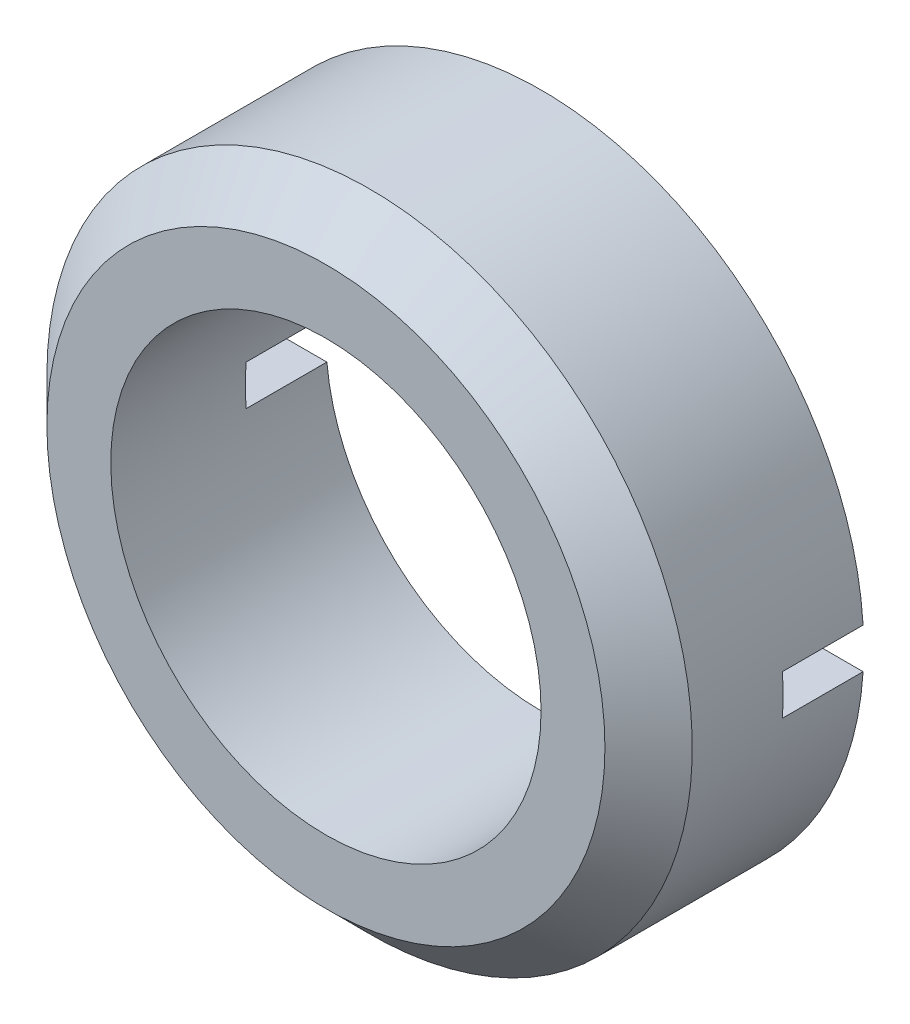
ISO-10303-21;
HEADER;
FILE_DESCRIPTION(('STEP AP214'),'2;1');
FILE_NAME('part.step','',(''),(''),'','','');
FILE_SCHEMA(('AUTOMOTIVE_DESIGN { 1 0 10303 214 1 1 1 1 }'));
ENDSEC;
DATA;
#1=APPLICATION_CONTEXT('core data for automotive mechanical design processes');
#2=APPLICATION_PROTOCOL_DEFINITION('international standard','automotive_design',2000,#1);
#3=PRODUCT_CONTEXT('',#1,'mechanical');
#4=PRODUCT('Part','Part','',(#3));
#5=PRODUCT_RELATED_PRODUCT_CATEGORY('part','',(#4));
#6=PRODUCT_DEFINITION_FORMATION('','',#4);
#7=PRODUCT_DEFINITION_CONTEXT('part definition',#1,'design');
#8=PRODUCT_DEFINITION('design','',#6,#7);
#9=PRODUCT_DEFINITION_SHAPE('','',#8);
#10=(LENGTH_UNIT() NAMED_UNIT(*) SI_UNIT(.MILLI.,.METRE.));
#11=(NAMED_UNIT(*) PLANE_ANGLE_UNIT() SI_UNIT($,.RADIAN.));
#12=(NAMED_UNIT(*) SI_UNIT($,.STERADIAN.) SOLID_ANGLE_UNIT());
#13=UNCERTAINTY_MEASURE_WITH_UNIT(LENGTH_MEASURE(1.E-05),#10,'distance_accuracy_value','');
#14=(GEOMETRIC_REPRESENTATION_CONTEXT(3) GLOBAL_UNCERTAINTY_ASSIGNED_CONTEXT((#13)) GLOBAL_UNIT_ASSIGNED_CONTEXT((#10,
#11,#12)) REPRESENTATION_CONTEXT('',''));
#15=CARTESIAN_POINT('',(0.,0.,0.));
#16=DIRECTION('',(0.,0.,1.));
#17=DIRECTION('',(1.,0.,0.));
#18=AXIS2_PLACEMENT_3D('',#15,#16,#17);
#19=CARTESIAN_POINT('',(0.,0.,-4.));
#20=DIRECTION('',(0.,0.,1.));
#21=DIRECTION('',(1.,0.,0.));
#22=AXIS2_PLACEMENT_3D('',#19,#20,#21);
#23=PLANE('',#22);
#24=DIRECTION('',(-1.,0.,0.));
#25=VECTOR('',#24,1.);
#26=CARTESIAN_POINT('',(0.,-0.75,-4.));
#27=LINE('',#26,#25);
#28=CARTESIAN_POINT('',(11.9765395670035,-0.75,-4.));
#29=VERTEX_POINT('',#28);
#30=CARTESIAN_POINT('',(7.96476616103699,-0.75,-4.));
#31=VERTEX_POINT('',#30);
#32=EDGE_CURVE('E130',#29,#31,#27,.T.);
#33=ORIENTED_EDGE('',*,*,#32,.F.);
#34=CARTESIAN_POINT('',(0.,0.,-4.));
#35=DIRECTION('',(0.,0.,1.));
#36=DIRECTION('',(1.,0.,0.));
#37=AXIS2_PLACEMENT_3D('',#34,#35,#36);
#38=CIRCLE('',#37,12.);
#39=CARTESIAN_POINT('',(-11.9765395670035,-0.75,-4.));
#40=VERTEX_POINT('',#39);
#41=EDGE_CURVE('E128',#40,#29,#38,.T.);
#42=ORIENTED_EDGE('',*,*,#41,.F.);
#43=CARTESIAN_POINT('',(-7.96476616103699,-0.75,-4.));
#44=VERTEX_POINT('',#43);
#45=EDGE_CURVE('E137',#44,#40,#27,.T.);
#46=ORIENTED_EDGE('',*,*,#45,.F.);
#47=CARTESIAN_POINT('',(0.,0.,-4.));
#48=DIRECTION('',(0.,0.,1.));
#49=DIRECTION('',(1.,0.,0.));
#50=AXIS2_PLACEMENT_3D('',#47,#48,#49);
#51=CIRCLE('',#50,8.);
#52=EDGE_CURVE('E142',#44,#31,#51,.T.);
#53=ORIENTED_EDGE('',*,*,#52,.T.);
#54=EDGE_LOOP('',(#33,#42,#46,#53));
#55=FACE_BOUND('',#54,.T.);
#56=ADVANCED_FACE('F43',(#55),#23,.F.);
#57=CARTESIAN_POINT('',(0.,0.,4.));
#58=DIRECTION('',(0.,0.,-1.));
#59=DIRECTION('',(-1.,0.,0.));
#60=AXIS2_PLACEMENT_3D('',#57,#58,#59);
#61=CYLINDRICAL_SURFACE('',#60,12.);
#62=CARTESIAN_POINT('',(0.,0.,2.37600000000003));
#63=DIRECTION('',(0.,0.,-1.));
#64=DIRECTION('',(-1.,0.,0.));
#65=AXIS2_PLACEMENT_3D('',#62,#63,#64);
#66=CIRCLE('',#65,12.);
#67=CARTESIAN_POINT('',(-12.,0.,2.37600000000003));
#68=VERTEX_POINT('',#67);
#69=EDGE_CURVE('E133',#68,#68,#66,.T.);
#70=ORIENTED_EDGE('',*,*,#69,.T.);
#71=EDGE_LOOP('',(#70));
#72=FACE_BOUND('',#71,.T.);
#73=DIRECTION('',(0.,0.,-1.));
#74=VECTOR('',#73,1.);
#75=CARTESIAN_POINT('',(-11.9765395670035,-0.75,4.));
#76=LINE('',#75,#74);
#77=CARTESIAN_POINT('',(-11.9765395670035,-0.75,-1.));
#78=VERTEX_POINT('',#77);
#79=EDGE_CURVE('E135',#40,#78,#76,.F.);
#80=ORIENTED_EDGE('',*,*,#79,.F.);
#81=ORIENTED_EDGE('',*,*,#41,.T.);
#82=DIRECTION('',(0.,0.,-1.));
#83=VECTOR('',#82,1.);
#84=CARTESIAN_POINT('',(11.9765395670035,-0.75,4.));
#85=LINE('',#84,#83);
#86=CARTESIAN_POINT('',(11.9765395670035,-0.75,-1.));
#87=VERTEX_POINT('',#86);
#88=EDGE_CURVE('E118',#87,#29,#85,.T.);
#89=ORIENTED_EDGE('',*,*,#88,.F.);
#90=CARTESIAN_POINT('',(0.,0.,-1.));
#91=DIRECTION('',(0.,0.,1.));
#92=DIRECTION('',(1.,0.,0.));
#93=AXIS2_PLACEMENT_3D('',#90,#91,#92);
#94=CIRCLE('',#93,12.);
#95=CARTESIAN_POINT('',(11.9765395670035,0.75,-1.));
#96=VERTEX_POINT('',#95);
#97=EDGE_CURVE('E107',#87,#96,#94,.T.);
#98=ORIENTED_EDGE('',*,*,#97,.T.);
#99=DIRECTION('',(0.,0.,-1.));
#100=VECTOR('',#99,1.);
#101=CARTESIAN_POINT('',(11.9765395670035,0.75,4.));
#102=LINE('',#101,#100);
#103=CARTESIAN_POINT('',(11.9765395670035,0.75,-4.));
#104=VERTEX_POINT('',#103);
#105=EDGE_CURVE('E172',#96,#104,#102,.T.);
#106=ORIENTED_EDGE('',*,*,#105,.T.);
#107=CARTESIAN_POINT('',(-11.9765395670035,0.75,-4.));
#108=VERTEX_POINT('',#107);
#109=EDGE_CURVE('E149',#104,#108,#38,.T.);
#110=ORIENTED_EDGE('',*,*,#109,.T.);
#111=DIRECTION('',(0.,0.,-1.));
#112=VECTOR('',#111,1.);
#113=CARTESIAN_POINT('',(-11.9765395670035,0.75,4.));
#114=LINE('',#113,#112);
#115=CARTESIAN_POINT('',(-11.9765395670035,0.75,-1.));
#116=VERTEX_POINT('',#115);
#117=EDGE_CURVE('E176',#108,#116,#114,.F.);
#118=ORIENTED_EDGE('',*,*,#117,.T.);
#119=EDGE_CURVE('E114',#116,#78,#94,.T.);
#120=ORIENTED_EDGE('',*,*,#119,.T.);
#121=EDGE_LOOP('',(#80,#81,#89,#98,#106,#110,#118,#120));
#122=FACE_BOUND('',#121,.T.);
#123=ADVANCED_FACE('F45',(#72,#122),#61,.T.);
#124=CARTESIAN_POINT('',(0.,0.,4.));
#125=DIRECTION('',(0.,0.,-1.));
#126=DIRECTION('',(-1.,0.,0.));
#127=AXIS2_PLACEMENT_3D('',#124,#125,#126);
#128=CYLINDRICAL_SURFACE('',#127,8.);
#129=CARTESIAN_POINT('',(0.,0.,4.));
#130=DIRECTION('',(0.,0.,1.));
#131=DIRECTION('',(1.,0.,0.));
#132=AXIS2_PLACEMENT_3D('',#129,#130,#131);
#133=CIRCLE('',#132,8.);
#134=CARTESIAN_POINT('',(8.,0.,4.));
#135=VERTEX_POINT('',#134);
#136=EDGE_CURVE('E143',#135,#135,#133,.T.);
#137=ORIENTED_EDGE('',*,*,#136,.T.);
#138=EDGE_LOOP('',(#137));
#139=FACE_BOUND('',#138,.T.);
#140=ORIENTED_EDGE('',*,*,#52,.F.);
#141=DIRECTION('',(0.,0.,-1.));
#142=VECTOR('',#141,1.);
#143=CARTESIAN_POINT('',(-7.96476616103699,-0.75,4.));
#144=LINE('',#143,#142);
#145=CARTESIAN_POINT('',(-7.964766161037,-0.75,-1.));
#146=VERTEX_POINT('',#145);
#147=EDGE_CURVE('E11',#44,#146,#144,.F.);
#148=ORIENTED_EDGE('',*,*,#147,.T.);
#149=CARTESIAN_POINT('',(0.,0.,-1.));
#150=DIRECTION('',(0.,0.,1.));
#151=DIRECTION('',(1.,0.,0.));
#152=AXIS2_PLACEMENT_3D('',#149,#150,#151);
#153=CIRCLE('',#152,8.);
#154=CARTESIAN_POINT('',(-7.964766161037,0.75,-1.));
#155=VERTEX_POINT('',#154);
#156=EDGE_CURVE('E155',#155,#146,#153,.T.);
#157=ORIENTED_EDGE('',*,*,#156,.F.);
#158=DIRECTION('',(0.,0.,-1.));
#159=VECTOR('',#158,1.);
#160=CARTESIAN_POINT('',(-7.96476616103699,0.75,4.));
#161=LINE('',#160,#159);
#162=CARTESIAN_POINT('',(-7.96476616103699,0.75,-4.));
#163=VERTEX_POINT('',#162);
#164=EDGE_CURVE('E51',#163,#155,#161,.F.);
#165=ORIENTED_EDGE('',*,*,#164,.F.);
#166=CARTESIAN_POINT('',(7.96476616103699,0.75,-4.));
#167=VERTEX_POINT('',#166);
#168=EDGE_CURVE('E146',#167,#163,#51,.T.);
#169=ORIENTED_EDGE('',*,*,#168,.F.);
#170=DIRECTION('',(0.,0.,-1.));
#171=VECTOR('',#170,1.);
#172=CARTESIAN_POINT('',(7.96476616103699,0.75,4.));
#173=LINE('',#172,#171);
#174=CARTESIAN_POINT('',(7.964766161037,0.75,-1.));
#175=VERTEX_POINT('',#174);
#176=EDGE_CURVE('E154',#175,#167,#173,.T.);
#177=ORIENTED_EDGE('',*,*,#176,.F.);
#178=CARTESIAN_POINT('',(7.964766161037,-0.75,-1.));
#179=VERTEX_POINT('',#178);
#180=EDGE_CURVE('E152',#179,#175,#153,.T.);
#181=ORIENTED_EDGE('',*,*,#180,.F.);
#182=DIRECTION('',(0.,0.,-1.));
#183=VECTOR('',#182,1.);
#184=CARTESIAN_POINT('',(7.96476616103699,-0.75,4.));
#185=LINE('',#184,#183);
#186=EDGE_CURVE('E121',#179,#31,#185,.T.);
#187=ORIENTED_EDGE('',*,*,#186,.T.);
#188=EDGE_LOOP('',(#140,#148,#157,#165,#169,#177,#181,#187));
#189=FACE_BOUND('',#188,.T.);
#190=ADVANCED_FACE('F169',(#139,#189),#128,.F.);
#191=CARTESIAN_POINT('',(0.,0.,4.));
#192=DIRECTION('',(0.,0.,1.));
#193=DIRECTION('',(1.,0.,0.));
#194=AXIS2_PLACEMENT_3D('',#191,#192,#193);
#195=PLANE('',#194);
#196=ORIENTED_EDGE('',*,*,#136,.F.);
#197=EDGE_LOOP('',(#196));
#198=FACE_BOUND('',#197,.T.);
#199=CARTESIAN_POINT('',(0.,0.,4.));
#200=DIRECTION('',(0.,0.,-1.));
#201=DIRECTION('',(-1.,0.,0.));
#202=AXIS2_PLACEMENT_3D('',#199,#200,#201);
#203=CIRCLE('',#202,10.376);
#204=CARTESIAN_POINT('',(-10.376,0.,4.));
#205=VERTEX_POINT('',#204);
#206=EDGE_CURVE('E129',#205,#205,#203,.T.);
#207=ORIENTED_EDGE('',*,*,#206,.F.);
#208=EDGE_LOOP('',(#207));
#209=FACE_BOUND('',#208,.T.);
#210=ADVANCED_FACE('F210',(#198,#209),#195,.T.);
#211=ORIENTED_EDGE('',*,*,#109,.F.);
#212=DIRECTION('',(-1.,0.,0.));
#213=VECTOR('',#212,1.);
#214=CARTESIAN_POINT('',(0.,0.75,-4.));
#215=LINE('',#214,#213);
#216=EDGE_CURVE('E173',#104,#167,#215,.T.);
#217=ORIENTED_EDGE('',*,*,#216,.T.);
#218=ORIENTED_EDGE('',*,*,#168,.T.);
#219=EDGE_CURVE('E179',#163,#108,#215,.T.);
#220=ORIENTED_EDGE('',*,*,#219,.T.);
#221=EDGE_LOOP('',(#211,#217,#218,#220));
#222=FACE_BOUND('',#221,.T.);
#223=ADVANCED_FACE('F189',(#222),#23,.F.);
#224=CARTESIAN_POINT('',(0.,0.,4.));
#225=DIRECTION('',(0.,0.,-1.));
#226=DIRECTION('',(-1.,0.,0.));
#227=AXIS2_PLACEMENT_3D('',#224,#225,#226);
#228=CONICAL_SURFACE('',#227,10.376,0.785398163397458);
#229=ORIENTED_EDGE('',*,*,#69,.F.);
#230=EDGE_LOOP('',(#229));
#231=FACE_BOUND('',#230,.T.);
#232=ORIENTED_EDGE('',*,*,#206,.T.);
#233=EDGE_LOOP('',(#232));
#234=FACE_BOUND('',#233,.T.);
#235=ADVANCED_FACE('F209',(#231,#234),#228,.T.);
#236=CARTESIAN_POINT('',(0.,0.,-1.));
#237=DIRECTION('',(0.,0.,1.));
#238=DIRECTION('',(1.,0.,0.));
#239=AXIS2_PLACEMENT_3D('',#236,#237,#238);
#240=PLANE('',#239);
#241=DIRECTION('',(-1.,0.,0.));
#242=VECTOR('',#241,1.);
#243=CARTESIAN_POINT('',(19.6419293107443,-0.75,-1.));
#244=LINE('',#243,#242);
#245=EDGE_CURVE('E66',#87,#179,#244,.T.);
#246=ORIENTED_EDGE('',*,*,#245,.T.);
#247=ORIENTED_EDGE('',*,*,#180,.T.);
#248=DIRECTION('',(-1.,0.,0.));
#249=VECTOR('',#248,1.);
#250=CARTESIAN_POINT('',(19.6419293107443,0.75,-1.));
#251=LINE('',#250,#249);
#252=EDGE_CURVE('E110',#96,#175,#251,.T.);
#253=ORIENTED_EDGE('',*,*,#252,.F.);
#254=ORIENTED_EDGE('',*,*,#97,.F.);
#255=EDGE_LOOP('',(#246,#247,#253,#254));
#256=FACE_BOUND('',#255,.T.);
#257=ADVANCED_FACE('F108',(#256),#240,.F.);
#258=CARTESIAN_POINT('',(19.6419293107443,0.75,-4.000012));
#259=DIRECTION('',(0.,1.,0.));
#260=DIRECTION('',(0.,0.,1.));
#261=AXIS2_PLACEMENT_3D('',#258,#259,#260);
#262=PLANE('',#261);
#263=ORIENTED_EDGE('',*,*,#252,.T.);
#264=ORIENTED_EDGE('',*,*,#176,.T.);
#265=ORIENTED_EDGE('',*,*,#216,.F.);
#266=ORIENTED_EDGE('',*,*,#105,.F.);
#267=EDGE_LOOP('',(#263,#264,#265,#266));
#268=FACE_BOUND('',#267,.T.);
#269=ADVANCED_FACE('F184',(#268),#262,.F.);
#270=CARTESIAN_POINT('',(19.6419293107443,-0.75,-4.000012));
#271=DIRECTION('',(0.,1.,0.));
#272=DIRECTION('',(0.,0.,1.));
#273=AXIS2_PLACEMENT_3D('',#270,#271,#272);
#274=PLANE('',#273);
#275=ORIENTED_EDGE('',*,*,#88,.T.);
#276=ORIENTED_EDGE('',*,*,#32,.T.);
#277=ORIENTED_EDGE('',*,*,#186,.F.);
#278=ORIENTED_EDGE('',*,*,#245,.F.);
#279=EDGE_LOOP('',(#275,#276,#277,#278));
#280=FACE_BOUND('',#279,.T.);
#281=ADVANCED_FACE('F117',(#280),#274,.T.);
#282=ORIENTED_EDGE('',*,*,#79,.T.);
#283=EDGE_CURVE('E123',#146,#78,#244,.T.);
#284=ORIENTED_EDGE('',*,*,#283,.F.);
#285=ORIENTED_EDGE('',*,*,#147,.F.);
#286=ORIENTED_EDGE('',*,*,#45,.T.);
#287=EDGE_LOOP('',(#282,#284,#285,#286));
#288=FACE_BOUND('',#287,.T.);
#289=ADVANCED_FACE('F166',(#288),#274,.T.);
#290=ORIENTED_EDGE('',*,*,#219,.F.);
#291=ORIENTED_EDGE('',*,*,#164,.T.);
#292=EDGE_CURVE('E58',#155,#116,#251,.T.);
#293=ORIENTED_EDGE('',*,*,#292,.T.);
#294=ORIENTED_EDGE('',*,*,#117,.F.);
#295=EDGE_LOOP('',(#290,#291,#293,#294));
#296=FACE_BOUND('',#295,.T.);
#297=ADVANCED_FACE('F190',(#296),#262,.F.);
#298=ORIENTED_EDGE('',*,*,#292,.F.);
#299=ORIENTED_EDGE('',*,*,#156,.T.);
#300=ORIENTED_EDGE('',*,*,#283,.T.);
#301=ORIENTED_EDGE('',*,*,#119,.F.);
#302=EDGE_LOOP('',(#298,#299,#300,#301));
#303=FACE_BOUND('',#302,.T.);
#304=ADVANCED_FACE('F162',(#303),#240,.F.);
#305=CLOSED_SHELL('',(#56,#123,#190,#210,#223,#235,#257,#269,#281,#289,#297,#304));
#306=MANIFOLD_SOLID_BREP('B2',#305);
#307=ADVANCED_BREP_SHAPE_REPRESENTATION('',(#18,#306),#14);
#308=SHAPE_DEFINITION_REPRESENTATION(#9,#307);
ENDSEC;
END-ISO-10303-21;
